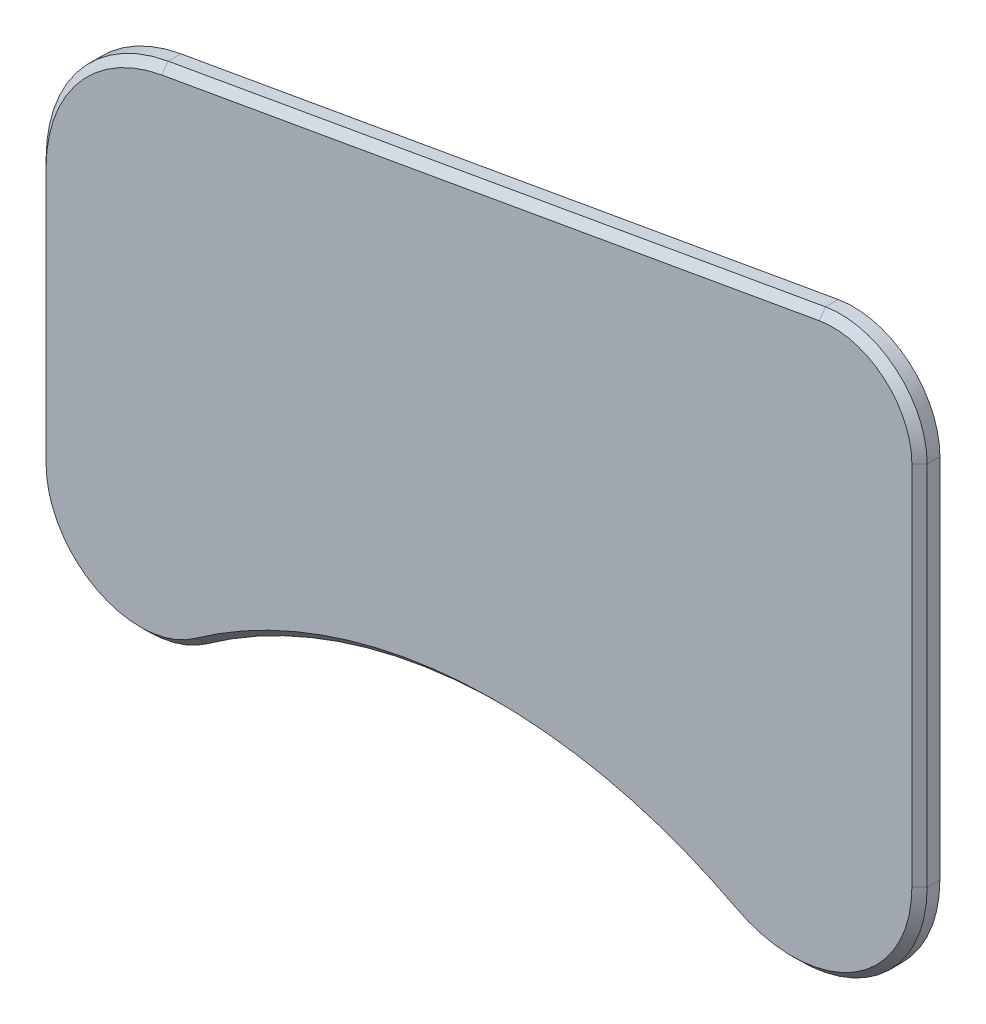
ISO-10303-21;
HEADER;
FILE_DESCRIPTION(('STEP AP214'),'2;1');
FILE_NAME('part.step','',(''),(''),'','','');
FILE_SCHEMA(('AUTOMOTIVE_DESIGN { 1 0 10303 214 1 1 1 1 }'));
ENDSEC;
DATA;
#1=APPLICATION_CONTEXT('core data for automotive mechanical design processes');
#2=APPLICATION_PROTOCOL_DEFINITION('international standard','automotive_design',2000,#1);
#3=PRODUCT_CONTEXT('',#1,'mechanical');
#4=PRODUCT('Part','Part','',(#3));
#5=PRODUCT_RELATED_PRODUCT_CATEGORY('part','',(#4));
#6=PRODUCT_DEFINITION_FORMATION('','',#4);
#7=PRODUCT_DEFINITION_CONTEXT('part definition',#1,'design');
#8=PRODUCT_DEFINITION('design','',#6,#7);
#9=PRODUCT_DEFINITION_SHAPE('','',#8);
#10=(LENGTH_UNIT() NAMED_UNIT(*) SI_UNIT(.MILLI.,.METRE.));
#11=(NAMED_UNIT(*) PLANE_ANGLE_UNIT() SI_UNIT($,.RADIAN.));
#12=(NAMED_UNIT(*) SI_UNIT($,.STERADIAN.) SOLID_ANGLE_UNIT());
#13=UNCERTAINTY_MEASURE_WITH_UNIT(LENGTH_MEASURE(1.E-05),#10,'distance_accuracy_value','');
#14=(GEOMETRIC_REPRESENTATION_CONTEXT(3) GLOBAL_UNCERTAINTY_ASSIGNED_CONTEXT((#13)) GLOBAL_UNIT_ASSIGNED_CONTEXT((#10,
#11,#12)) REPRESENTATION_CONTEXT('',''));
#15=CARTESIAN_POINT('',(0.,0.,0.));
#16=DIRECTION('',(0.,0.,1.));
#17=DIRECTION('',(1.,0.,0.));
#18=AXIS2_PLACEMENT_3D('',#15,#16,#17);
#19=CARTESIAN_POINT('',(73.,26.0569889343465,4.));
#20=DIRECTION('',(0.,0.,-1.));
#21=DIRECTION('',(-1.,0.,0.));
#22=AXIS2_PLACEMENT_3D('',#19,#20,#21);
#23=CYLINDRICAL_SURFACE('',#22,17.);
#24=DIRECTION('',(0.,0.,-1.));
#25=VECTOR('',#24,1.);
#26=CARTESIAN_POINT('',(70.0479809796623,42.798720735554,4.));
#27=LINE('',#26,#25);
#28=CARTESIAN_POINT('',(70.0479809796623,42.798720735554,2.5));
#29=VERTEX_POINT('',#28);
#30=CARTESIAN_POINT('',(70.0479809796623,42.798720735554,0.));
#31=VERTEX_POINT('',#30);
#32=EDGE_CURVE('E120',#29,#31,#27,.T.);
#33=ORIENTED_EDGE('',*,*,#32,.F.);
#34=CARTESIAN_POINT('',(73.,26.0569889343465,2.5));
#35=DIRECTION('',(0.,0.,1.));
#36=DIRECTION('',(1.,0.,0.));
#37=AXIS2_PLACEMENT_3D('',#34,#35,#36);
#38=CIRCLE('',#37,17.);
#39=CARTESIAN_POINT('',(90.,26.0569889343465,2.5));
#40=VERTEX_POINT('',#39);
#41=EDGE_CURVE('E201',#29,#40,#38,.F.);
#42=ORIENTED_EDGE('',*,*,#41,.T.);
#43=DIRECTION('',(0.,0.,-1.));
#44=VECTOR('',#43,1.);
#45=CARTESIAN_POINT('',(90.,26.0569889343465,4.));
#46=LINE('',#45,#44);
#47=CARTESIAN_POINT('',(90.,26.0569889343465,0.));
#48=VERTEX_POINT('',#47);
#49=EDGE_CURVE('E141',#40,#48,#46,.T.);
#50=ORIENTED_EDGE('',*,*,#49,.T.);
#51=CARTESIAN_POINT('',(73.,26.0569889343465,0.));
#52=DIRECTION('',(0.,0.,1.));
#53=DIRECTION('',(1.,0.,0.));
#54=AXIS2_PLACEMENT_3D('',#51,#52,#53);
#55=CIRCLE('',#54,17.);
#56=EDGE_CURVE('E135',#48,#31,#55,.T.);
#57=ORIENTED_EDGE('',*,*,#56,.T.);
#58=EDGE_LOOP('',(#33,#42,#50,#57));
#59=FACE_BOUND('',#58,.T.);
#60=ADVANCED_FACE('F33',(#59),#23,.T.);
#61=CARTESIAN_POINT('',(70.0479809796623,42.798720735554,4.));
#62=DIRECTION('',(0.173648177666925,-0.984807753012209,0.));
#63=DIRECTION('',(0.984807753012209,0.173648177666925,0.));
#64=AXIS2_PLACEMENT_3D('',#61,#62,#63);
#65=PLANE('',#64);
#66=DIRECTION('',(0.,0.,-1.));
#67=VECTOR('',#66,1.);
#68=CARTESIAN_POINT('',(-59.0357971523408,20.0377678790973,4.));
#69=LINE('',#68,#67);
#70=CARTESIAN_POINT('',(-59.0357971523408,20.0377678790973,2.5));
#71=VERTEX_POINT('',#70);
#72=CARTESIAN_POINT('',(-59.0357971523408,20.0377678790973,0.));
#73=VERTEX_POINT('',#72);
#74=EDGE_CURVE('E129',#71,#73,#69,.T.);
#75=ORIENTED_EDGE('',*,*,#74,.F.);
#76=DIRECTION('',(0.984807753012209,0.173648177666925,0.));
#77=VECTOR('',#76,1.);
#78=CARTESIAN_POINT('',(70.0479809796623,42.798720735554,2.5));
#79=LINE('',#78,#77);
#80=EDGE_CURVE('E11',#71,#29,#79,.T.);
#81=ORIENTED_EDGE('',*,*,#80,.T.);
#82=ORIENTED_EDGE('',*,*,#32,.T.);
#83=DIRECTION('',(-0.984807753012209,-0.173648177666925,0.));
#84=VECTOR('',#83,1.);
#85=CARTESIAN_POINT('',(70.0479809796623,42.798720735554,0.));
#86=LINE('',#85,#84);
#87=EDGE_CURVE('E123',#31,#73,#86,.T.);
#88=ORIENTED_EDGE('',*,*,#87,.T.);
#89=EDGE_LOOP('',(#75,#81,#82,#88));
#90=FACE_BOUND('',#89,.T.);
#91=ADVANCED_FACE('F122',(#90),#65,.F.);
#92=CARTESIAN_POINT('',(-54.,-8.52165695825679,4.));
#93=DIRECTION('',(0.,0.,-1.));
#94=DIRECTION('',(-1.,0.,0.));
#95=AXIS2_PLACEMENT_3D('',#92,#93,#94);
#96=CYLINDRICAL_SURFACE('',#95,29.);
#97=DIRECTION('',(0.,0.,-1.));
#98=VECTOR('',#97,1.);
#99=CARTESIAN_POINT('',(-83.,-8.52165695825678,4.));
#100=LINE('',#99,#98);
#101=CARTESIAN_POINT('',(-83.,-8.52165695825678,2.5));
#102=VERTEX_POINT('',#101);
#103=CARTESIAN_POINT('',(-83.,-8.52165695825678,0.));
#104=VERTEX_POINT('',#103);
#105=EDGE_CURVE('E171',#102,#104,#100,.T.);
#106=ORIENTED_EDGE('',*,*,#105,.F.);
#107=CARTESIAN_POINT('',(-54.,-8.52165695825679,2.5));
#108=DIRECTION('',(0.,0.,1.));
#109=DIRECTION('',(1.,0.,0.));
#110=AXIS2_PLACEMENT_3D('',#107,#108,#109);
#111=CIRCLE('',#110,29.);
#112=EDGE_CURVE('E42',#102,#71,#111,.F.);
#113=ORIENTED_EDGE('',*,*,#112,.T.);
#114=ORIENTED_EDGE('',*,*,#74,.T.);
#115=CARTESIAN_POINT('',(-54.,-8.52165695825679,0.));
#116=DIRECTION('',(0.,0.,1.));
#117=DIRECTION('',(1.,0.,0.));
#118=AXIS2_PLACEMENT_3D('',#115,#116,#117);
#119=CIRCLE('',#118,29.);
#120=EDGE_CURVE('E138',#73,#104,#119,.T.);
#121=ORIENTED_EDGE('',*,*,#120,.T.);
#122=EDGE_LOOP('',(#106,#113,#114,#121));
#123=FACE_BOUND('',#122,.T.);
#124=ADVANCED_FACE('F284',(#123),#96,.T.);
#125=CARTESIAN_POINT('',(-83.,-8.52165695825678,4.));
#126=DIRECTION('',(1.,0.,0.));
#127=DIRECTION('',(0.,1.,0.));
#128=AXIS2_PLACEMENT_3D('',#125,#126,#127);
#129=PLANE('',#128);
#130=DIRECTION('',(0.,0.,-1.));
#131=VECTOR('',#130,1.);
#132=CARTESIAN_POINT('',(-83.,-58.9216569582568,4.));
#133=LINE('',#132,#131);
#134=CARTESIAN_POINT('',(-83.,-58.9216569582568,2.5));
#135=VERTEX_POINT('',#134);
#136=CARTESIAN_POINT('',(-83.,-58.9216569582568,0.));
#137=VERTEX_POINT('',#136);
#138=EDGE_CURVE('E169',#135,#137,#133,.T.);
#139=ORIENTED_EDGE('',*,*,#138,.F.);
#140=DIRECTION('',(0.,1.,0.));
#141=VECTOR('',#140,1.);
#142=CARTESIAN_POINT('',(-83.,-8.52165695825678,2.5));
#143=LINE('',#142,#141);
#144=EDGE_CURVE('E199',#135,#102,#143,.T.);
#145=ORIENTED_EDGE('',*,*,#144,.T.);
#146=ORIENTED_EDGE('',*,*,#105,.T.);
#147=DIRECTION('',(0.,-1.,0.));
#148=VECTOR('',#147,1.);
#149=CARTESIAN_POINT('',(-83.,-8.52165695825678,0.));
#150=LINE('',#149,#148);
#151=EDGE_CURVE('E148',#104,#137,#150,.T.);
#152=ORIENTED_EDGE('',*,*,#151,.T.);
#153=EDGE_LOOP('',(#139,#145,#146,#152));
#154=FACE_BOUND('',#153,.T.);
#155=ADVANCED_FACE('F266',(#154),#129,.F.);
#156=CARTESIAN_POINT('',(-63.,-58.9216569582568,4.));
#157=DIRECTION('',(0.,0.,-1.));
#158=DIRECTION('',(-1.,0.,0.));
#159=AXIS2_PLACEMENT_3D('',#156,#157,#158);
#160=CYLINDRICAL_SURFACE('',#159,20.);
#161=DIRECTION('',(0.,0.,-1.));
#162=VECTOR('',#161,1.);
#163=CARTESIAN_POINT('',(-51.368431105947,-75.1914635048295,4.));
#164=LINE('',#163,#162);
#165=CARTESIAN_POINT('',(-51.368431105947,-75.1914635048295,2.5));
#166=VERTEX_POINT('',#165);
#167=CARTESIAN_POINT('',(-51.368431105947,-75.1914635048295,0.));
#168=VERTEX_POINT('',#167);
#169=EDGE_CURVE('E167',#166,#168,#164,.T.);
#170=ORIENTED_EDGE('',*,*,#169,.F.);
#171=CARTESIAN_POINT('',(-63.,-58.9216569582568,2.5));
#172=DIRECTION('',(0.,0.,1.));
#173=DIRECTION('',(1.,0.,0.));
#174=AXIS2_PLACEMENT_3D('',#171,#172,#173);
#175=CIRCLE('',#174,20.);
#176=EDGE_CURVE('E195',#166,#135,#175,.F.);
#177=ORIENTED_EDGE('',*,*,#176,.T.);
#178=ORIENTED_EDGE('',*,*,#138,.T.);
#179=CARTESIAN_POINT('',(-63.,-58.9216569582568,0.));
#180=DIRECTION('',(0.,0.,1.));
#181=DIRECTION('',(1.,0.,0.));
#182=AXIS2_PLACEMENT_3D('',#179,#180,#181);
#183=CIRCLE('',#182,20.);
#184=EDGE_CURVE('E151',#137,#168,#183,.T.);
#185=ORIENTED_EDGE('',*,*,#184,.T.);
#186=EDGE_LOOP('',(#170,#177,#178,#185));
#187=FACE_BOUND('',#186,.T.);
#188=ADVANCED_FACE('F263',(#187),#160,.T.);
#189=CARTESIAN_POINT('',(6.78941336431773,-156.540496237693,4.));
#190=DIRECTION('',(0.,0.,-1.));
#191=DIRECTION('',(-1.,0.,0.));
#192=AXIS2_PLACEMENT_3D('',#189,#190,#191);
#193=CYLINDRICAL_SURFACE('',#192,100.);
#194=DIRECTION('',(0.,0.,-1.));
#195=VECTOR('',#194,1.);
#196=CARTESIAN_POINT('',(53.3578826728635,-68.045424814144,4.));
#197=LINE('',#196,#195);
#198=CARTESIAN_POINT('',(53.3578826728635,-68.045424814144,2.5));
#199=VERTEX_POINT('',#198);
#200=CARTESIAN_POINT('',(53.3578826728635,-68.045424814144,0.));
#201=VERTEX_POINT('',#200);
#202=EDGE_CURVE('E165',#199,#201,#197,.T.);
#203=ORIENTED_EDGE('',*,*,#202,.F.);
#204=CARTESIAN_POINT('',(6.78941336431773,-156.540496237693,2.5));
#205=DIRECTION('',(0.,0.,1.));
#206=DIRECTION('',(1.,0.,0.));
#207=AXIS2_PLACEMENT_3D('',#204,#205,#206);
#208=CIRCLE('',#207,100.);
#209=EDGE_CURVE('E190',#199,#166,#208,.T.);
#210=ORIENTED_EDGE('',*,*,#209,.T.);
#211=ORIENTED_EDGE('',*,*,#169,.T.);
#212=CARTESIAN_POINT('',(6.78941336431773,-156.540496237693,0.));
#213=DIRECTION('',(0.,0.,-1.));
#214=DIRECTION('',(1.,0.,0.));
#215=AXIS2_PLACEMENT_3D('',#212,#213,#214);
#216=CIRCLE('',#215,100.);
#217=EDGE_CURVE('E154',#168,#201,#216,.T.);
#218=ORIENTED_EDGE('',*,*,#217,.T.);
#219=EDGE_LOOP('',(#203,#210,#211,#218));
#220=FACE_BOUND('',#219,.T.);
#221=ADVANCED_FACE('F248',(#220),#193,.F.);
#222=CARTESIAN_POINT('',(65.,-45.9216569582568,4.));
#223=DIRECTION('',(0.,0.,-1.));
#224=DIRECTION('',(-1.,0.,0.));
#225=AXIS2_PLACEMENT_3D('',#222,#223,#224);
#226=CYLINDRICAL_SURFACE('',#225,25.);
#227=DIRECTION('',(0.,0.,-1.));
#228=VECTOR('',#227,1.);
#229=CARTESIAN_POINT('',(90.,-45.9216569582568,4.));
#230=LINE('',#229,#228);
#231=CARTESIAN_POINT('',(90.,-45.9216569582568,2.5));
#232=VERTEX_POINT('',#231);
#233=CARTESIAN_POINT('',(90.,-45.9216569582568,0.));
#234=VERTEX_POINT('',#233);
#235=EDGE_CURVE('E163',#232,#234,#230,.T.);
#236=ORIENTED_EDGE('',*,*,#235,.F.);
#237=CARTESIAN_POINT('',(65.,-45.9216569582568,2.5));
#238=DIRECTION('',(0.,0.,1.));
#239=DIRECTION('',(1.,0.,0.));
#240=AXIS2_PLACEMENT_3D('',#237,#238,#239);
#241=CIRCLE('',#240,25.);
#242=EDGE_CURVE('E193',#232,#199,#241,.F.);
#243=ORIENTED_EDGE('',*,*,#242,.T.);
#244=ORIENTED_EDGE('',*,*,#202,.T.);
#245=CARTESIAN_POINT('',(65.,-45.9216569582568,0.));
#246=DIRECTION('',(0.,0.,1.));
#247=DIRECTION('',(1.,0.,0.));
#248=AXIS2_PLACEMENT_3D('',#245,#246,#247);
#249=CIRCLE('',#248,25.);
#250=EDGE_CURVE('E157',#201,#234,#249,.T.);
#251=ORIENTED_EDGE('',*,*,#250,.T.);
#252=EDGE_LOOP('',(#236,#243,#244,#251));
#253=FACE_BOUND('',#252,.T.);
#254=ADVANCED_FACE('F245',(#253),#226,.T.);
#255=CARTESIAN_POINT('',(90.,-45.9216569582568,4.));
#256=DIRECTION('',(-1.,0.,0.));
#257=DIRECTION('',(0.,-1.,0.));
#258=AXIS2_PLACEMENT_3D('',#255,#256,#257);
#259=PLANE('',#258);
#260=ORIENTED_EDGE('',*,*,#49,.F.);
#261=DIRECTION('',(0.,-1.,0.));
#262=VECTOR('',#261,1.);
#263=CARTESIAN_POINT('',(90.,-45.9216569582568,2.5));
#264=LINE('',#263,#262);
#265=EDGE_CURVE('E197',#40,#232,#264,.T.);
#266=ORIENTED_EDGE('',*,*,#265,.T.);
#267=ORIENTED_EDGE('',*,*,#235,.T.);
#268=DIRECTION('',(0.,1.,0.));
#269=VECTOR('',#268,1.);
#270=CARTESIAN_POINT('',(90.,-45.9216569582568,0.));
#271=LINE('',#270,#269);
#272=EDGE_CURVE('E160',#234,#48,#271,.T.);
#273=ORIENTED_EDGE('',*,*,#272,.T.);
#274=EDGE_LOOP('',(#260,#266,#267,#273));
#275=FACE_BOUND('',#274,.T.);
#276=ADVANCED_FACE('F355',(#275),#259,.F.);
#277=CARTESIAN_POINT('',(73.,26.0569889343465,4.));
#278=DIRECTION('',(0.,0.,1.));
#279=DIRECTION('',(1.,0.,0.));
#280=AXIS2_PLACEMENT_3D('',#277,#278,#279);
#281=PLANE('',#280);
#282=CARTESIAN_POINT('',(-63.,-58.9216569582568,4.));
#283=DIRECTION('',(0.,0.,1.));
#284=DIRECTION('',(1.,0.,0.));
#285=AXIS2_PLACEMENT_3D('',#282,#283,#284);
#286=CIRCLE('',#285,18.5);
#287=CARTESIAN_POINT('',(-81.5,-58.9216569582568,4.));
#288=VERTEX_POINT('',#287);
#289=CARTESIAN_POINT('',(-52.240798773001,-73.9712280138365,4.));
#290=VERTEX_POINT('',#289);
#291=EDGE_CURVE('E183',#288,#290,#286,.T.);
#292=ORIENTED_EDGE('',*,*,#291,.T.);
#293=CARTESIAN_POINT('',(6.78941336431773,-156.540496237693,4.));
#294=DIRECTION('',(0.,0.,1.));
#295=DIRECTION('',(1.,0.,0.));
#296=AXIS2_PLACEMENT_3D('',#293,#294,#295);
#297=CIRCLE('',#296,101.5);
#298=CARTESIAN_POINT('',(54.0564097124917,-66.7179987427908,4.));
#299=VERTEX_POINT('',#298);
#300=EDGE_CURVE('E187',#290,#299,#297,.F.);
#301=ORIENTED_EDGE('',*,*,#300,.T.);
#302=CARTESIAN_POINT('',(65.,-45.9216569582568,4.));
#303=DIRECTION('',(0.,0.,1.));
#304=DIRECTION('',(1.,0.,0.));
#305=AXIS2_PLACEMENT_3D('',#302,#303,#304);
#306=CIRCLE('',#305,23.5);
#307=CARTESIAN_POINT('',(88.5,-45.9216569582568,4.));
#308=VERTEX_POINT('',#307);
#309=EDGE_CURVE('E185',#299,#308,#306,.T.);
#310=ORIENTED_EDGE('',*,*,#309,.T.);
#311=DIRECTION('',(0.,1.,0.));
#312=VECTOR('',#311,1.);
#313=CARTESIAN_POINT('',(88.5,26.0569889343465,4.));
#314=LINE('',#313,#312);
#315=CARTESIAN_POINT('',(88.5,26.0569889343465,4.));
#316=VERTEX_POINT('',#315);
#317=EDGE_CURVE('E181',#308,#316,#314,.T.);
#318=ORIENTED_EDGE('',*,*,#317,.T.);
#319=CARTESIAN_POINT('',(73.,26.0569889343465,4.));
#320=DIRECTION('',(0.,0.,1.));
#321=DIRECTION('',(1.,0.,0.));
#322=AXIS2_PLACEMENT_3D('',#319,#320,#321);
#323=CIRCLE('',#322,15.5);
#324=CARTESIAN_POINT('',(70.3084532461627,41.3215091060357,4.));
#325=VERTEX_POINT('',#324);
#326=EDGE_CURVE('E177',#316,#325,#323,.T.);
#327=ORIENTED_EDGE('',*,*,#326,.T.);
#328=DIRECTION('',(-0.984807753012209,-0.173648177666925,0.));
#329=VECTOR('',#328,1.);
#330=CARTESIAN_POINT('',(-58.7753248858404,18.5605562495789,4.));
#331=LINE('',#330,#329);
#332=CARTESIAN_POINT('',(-58.7753248858404,18.5605562495789,4.));
#333=VERTEX_POINT('',#332);
#334=EDGE_CURVE('E128',#325,#333,#331,.T.);
#335=ORIENTED_EDGE('',*,*,#334,.T.);
#336=CARTESIAN_POINT('',(-54.,-8.52165695825679,4.));
#337=DIRECTION('',(0.,0.,1.));
#338=DIRECTION('',(1.,0.,0.));
#339=AXIS2_PLACEMENT_3D('',#336,#337,#338);
#340=CIRCLE('',#339,27.5);
#341=CARTESIAN_POINT('',(-81.5,-8.52165695825678,4.));
#342=VERTEX_POINT('',#341);
#343=EDGE_CURVE('E175',#333,#342,#340,.T.);
#344=ORIENTED_EDGE('',*,*,#343,.T.);
#345=DIRECTION('',(0.,-1.,0.));
#346=VECTOR('',#345,1.);
#347=CARTESIAN_POINT('',(-81.5,-58.9216569582568,4.));
#348=LINE('',#347,#346);
#349=EDGE_CURVE('E179',#342,#288,#348,.T.);
#350=ORIENTED_EDGE('',*,*,#349,.T.);
#351=EDGE_LOOP('',(#292,#301,#310,#318,#327,#335,#344,#350));
#352=FACE_BOUND('',#351,.T.);
#353=ADVANCED_FACE('F230',(#352),#281,.T.);
#354=CARTESIAN_POINT('',(73.,26.0569889343465,0.));
#355=DIRECTION('',(0.,0.,1.));
#356=DIRECTION('',(1.,0.,0.));
#357=AXIS2_PLACEMENT_3D('',#354,#355,#356);
#358=PLANE('',#357);
#359=ORIENTED_EDGE('',*,*,#56,.F.);
#360=ORIENTED_EDGE('',*,*,#272,.F.);
#361=ORIENTED_EDGE('',*,*,#250,.F.);
#362=ORIENTED_EDGE('',*,*,#217,.F.);
#363=ORIENTED_EDGE('',*,*,#184,.F.);
#364=ORIENTED_EDGE('',*,*,#151,.F.);
#365=ORIENTED_EDGE('',*,*,#120,.F.);
#366=ORIENTED_EDGE('',*,*,#87,.F.);
#367=EDGE_LOOP('',(#359,#360,#361,#362,#363,#364,#365,#366));
#368=FACE_BOUND('',#367,.T.);
#369=ADVANCED_FACE('F133',(#368),#358,.F.);
#370=CARTESIAN_POINT('',(70.3084532461627,41.3215091060357,4.));
#371=DIRECTION('',(-0.122787803968968,0.696364240320016,0.707106781186552));
#372=DIRECTION('',(0.984807753012209,0.173648177666925,0.));
#373=AXIS2_PLACEMENT_3D('',#370,#371,#372);
#374=PLANE('',#373);
#375=DIRECTION('',(0.122787803968969,-0.696364240320024,0.707106781186543));
#376=VECTOR('',#375,1.);
#377=CARTESIAN_POINT('',(70.0479809796623,42.798720735554,2.5));
#378=LINE('',#377,#376);
#379=EDGE_CURVE('E145',#29,#325,#378,.T.);
#380=ORIENTED_EDGE('',*,*,#379,.F.);
#381=ORIENTED_EDGE('',*,*,#80,.F.);
#382=DIRECTION('',(-0.122787803968969,0.696364240320024,-0.707106781186543));
#383=VECTOR('',#382,1.);
#384=CARTESIAN_POINT('',(-58.7753248858404,18.5605562495789,4.));
#385=LINE('',#384,#383);
#386=EDGE_CURVE('E37',#333,#71,#385,.T.);
#387=ORIENTED_EDGE('',*,*,#386,.F.);
#388=ORIENTED_EDGE('',*,*,#334,.F.);
#389=EDGE_LOOP('',(#380,#381,#387,#388));
#390=FACE_BOUND('',#389,.T.);
#391=ADVANCED_FACE('F35',(#390),#374,.T.);
#392=CARTESIAN_POINT('',(-54.,-8.52165695825679,4.));
#393=DIRECTION('',(0.,0.,-1.));
#394=DIRECTION('',(-1.,0.,0.));
#395=AXIS2_PLACEMENT_3D('',#392,#393,#394);
#396=CONICAL_SURFACE('',#395,27.5,0.785398163397453);
#397=ORIENTED_EDGE('',*,*,#386,.T.);
#398=ORIENTED_EDGE('',*,*,#112,.F.);
#399=DIRECTION('',(-0.707106781186551,0.,-0.707106781186544));
#400=VECTOR('',#399,1.);
#401=CARTESIAN_POINT('',(-81.5,-8.52165695825678,4.));
#402=LINE('',#401,#400);
#403=EDGE_CURVE('E217',#342,#102,#402,.T.);
#404=ORIENTED_EDGE('',*,*,#403,.F.);
#405=ORIENTED_EDGE('',*,*,#343,.F.);
#406=EDGE_LOOP('',(#397,#398,#404,#405));
#407=FACE_BOUND('',#406,.T.);
#408=ADVANCED_FACE('F272',(#407),#396,.T.);
#409=CARTESIAN_POINT('',(73.,26.0569889343465,4.));
#410=DIRECTION('',(0.,0.,-1.));
#411=DIRECTION('',(-1.,0.,0.));
#412=AXIS2_PLACEMENT_3D('',#409,#410,#411);
#413=CONICAL_SURFACE('',#412,15.5,0.785398163397455);
#414=ORIENTED_EDGE('',*,*,#379,.T.);
#415=ORIENTED_EDGE('',*,*,#326,.F.);
#416=DIRECTION('',(-0.707106781186551,0.,0.707106781186544));
#417=VECTOR('',#416,1.);
#418=CARTESIAN_POINT('',(90.,26.0569889343465,2.5));
#419=LINE('',#418,#417);
#420=EDGE_CURVE('E214',#40,#316,#419,.T.);
#421=ORIENTED_EDGE('',*,*,#420,.F.);
#422=ORIENTED_EDGE('',*,*,#41,.F.);
#423=EDGE_LOOP('',(#414,#415,#421,#422));
#424=FACE_BOUND('',#423,.T.);
#425=ADVANCED_FACE('F223',(#424),#413,.T.);
#426=CARTESIAN_POINT('',(-81.5,26.0569889343465,4.));
#427=DIRECTION('',(-0.707106781186546,0.,0.707106781186549));
#428=DIRECTION('',(0.,1.,0.));
#429=AXIS2_PLACEMENT_3D('',#426,#427,#428);
#430=PLANE('',#429);
#431=ORIENTED_EDGE('',*,*,#403,.T.);
#432=ORIENTED_EDGE('',*,*,#144,.F.);
#433=DIRECTION('',(-0.707106781186547,0.,-0.707106781186547));
#434=VECTOR('',#433,1.);
#435=CARTESIAN_POINT('',(-81.5,-58.9216569582568,4.));
#436=LINE('',#435,#434);
#437=EDGE_CURVE('E211',#288,#135,#436,.T.);
#438=ORIENTED_EDGE('',*,*,#437,.F.);
#439=ORIENTED_EDGE('',*,*,#349,.F.);
#440=EDGE_LOOP('',(#431,#432,#438,#439));
#441=FACE_BOUND('',#440,.T.);
#442=ADVANCED_FACE('F269',(#441),#430,.T.);
#443=CARTESIAN_POINT('',(88.5,26.0569889343465,4.));
#444=DIRECTION('',(0.707106781186544,0.,0.707106781186551));
#445=DIRECTION('',(0.,-1.,0.));
#446=AXIS2_PLACEMENT_3D('',#443,#444,#445);
#447=PLANE('',#446);
#448=ORIENTED_EDGE('',*,*,#420,.T.);
#449=ORIENTED_EDGE('',*,*,#317,.F.);
#450=DIRECTION('',(-0.707106781186551,0.,0.707106781186544));
#451=VECTOR('',#450,1.);
#452=CARTESIAN_POINT('',(90.,-45.9216569582568,2.5));
#453=LINE('',#452,#451);
#454=EDGE_CURVE('E208',#232,#308,#453,.T.);
#455=ORIENTED_EDGE('',*,*,#454,.F.);
#456=ORIENTED_EDGE('',*,*,#265,.F.);
#457=EDGE_LOOP('',(#448,#449,#455,#456));
#458=FACE_BOUND('',#457,.T.);
#459=ADVANCED_FACE('F236',(#458),#447,.T.);
#460=CARTESIAN_POINT('',(-63.,-58.9216569582568,4.));
#461=DIRECTION('',(0.,0.,-1.));
#462=DIRECTION('',(-1.,0.,0.));
#463=AXIS2_PLACEMENT_3D('',#460,#461,#462);
#464=CONICAL_SURFACE('',#463,18.5,0.785398163397454);
#465=ORIENTED_EDGE('',*,*,#437,.T.);
#466=ORIENTED_EDGE('',*,*,#176,.F.);
#467=DIRECTION('',(0.411238062041169,-0.575224526883746,-0.707106781186543));
#468=VECTOR('',#467,1.);
#469=CARTESIAN_POINT('',(-52.240798773001,-73.9712280138365,4.));
#470=LINE('',#469,#468);
#471=EDGE_CURVE('E206',#290,#166,#470,.T.);
#472=ORIENTED_EDGE('',*,*,#471,.F.);
#473=ORIENTED_EDGE('',*,*,#291,.F.);
#474=EDGE_LOOP('',(#465,#466,#472,#473));
#475=FACE_BOUND('',#474,.T.);
#476=ADVANCED_FACE('F259',(#475),#464,.T.);
#477=CARTESIAN_POINT('',(65.,-45.9216569582568,4.));
#478=DIRECTION('',(0.,0.,-1.));
#479=DIRECTION('',(-1.,0.,0.));
#480=AXIS2_PLACEMENT_3D('',#477,#478,#479);
#481=CONICAL_SURFACE('',#480,23.5,0.785398163397455);
#482=ORIENTED_EDGE('',*,*,#454,.T.);
#483=ORIENTED_EDGE('',*,*,#309,.F.);
#484=DIRECTION('',(0.329288804375506,0.6257546510518,0.70710678118654));
#485=VECTOR('',#484,1.);
#486=CARTESIAN_POINT('',(53.3578826728635,-68.045424814144,2.5));
#487=LINE('',#486,#485);
#488=EDGE_CURVE('E204',#199,#299,#487,.T.);
#489=ORIENTED_EDGE('',*,*,#488,.F.);
#490=ORIENTED_EDGE('',*,*,#242,.F.);
#491=EDGE_LOOP('',(#482,#483,#489,#490));
#492=FACE_BOUND('',#491,.T.);
#493=ADVANCED_FACE('F240',(#492),#481,.T.);
#494=CARTESIAN_POINT('',(6.78941336431773,-156.540496237693,4.));
#495=DIRECTION('',(0.,0.,1.));
#496=DIRECTION('',(1.,0.,0.));
#497=AXIS2_PLACEMENT_3D('',#494,#495,#496);
#498=CONICAL_SURFACE('',#497,101.5,0.785398163397453);
#499=ORIENTED_EDGE('',*,*,#471,.T.);
#500=ORIENTED_EDGE('',*,*,#209,.F.);
#501=ORIENTED_EDGE('',*,*,#488,.T.);
#502=ORIENTED_EDGE('',*,*,#300,.F.);
#503=EDGE_LOOP('',(#499,#500,#501,#502));
#504=FACE_BOUND('',#503,.T.);
#505=ADVANCED_FACE('F253',(#504),#498,.F.);
#506=CLOSED_SHELL('',(#60,#91,#124,#155,#188,#221,#254,#276,#353,#369,#391,#408,#425,#442,#459,
#476,#493,#505));
#507=MANIFOLD_SOLID_BREP('B2',#506);
#508=ADVANCED_BREP_SHAPE_REPRESENTATION('',(#18,#507),#14);
#509=SHAPE_DEFINITION_REPRESENTATION(#9,#508);
ENDSEC;
END-ISO-10303-21;
